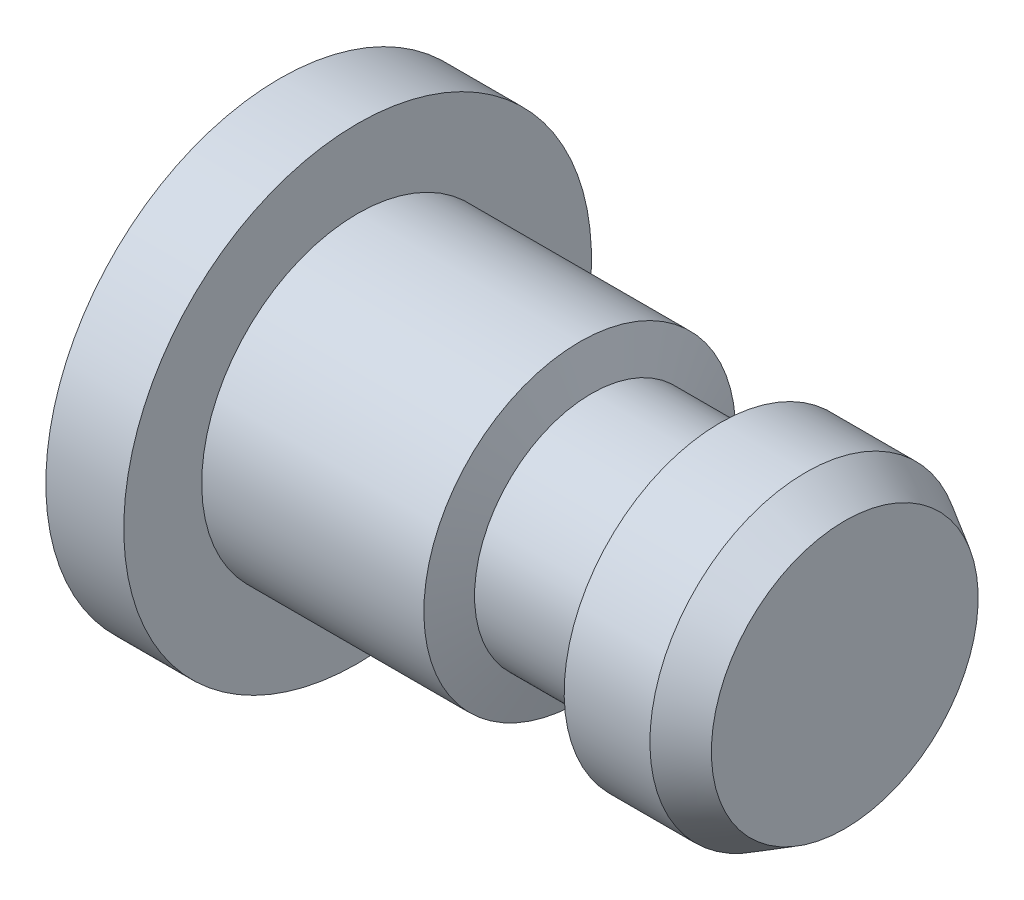
ISO-10303-21;
HEADER;
FILE_DESCRIPTION(('STEP AP214'),'2;1');
FILE_NAME('part.step','',(''),(''),'','','');
FILE_SCHEMA(('AUTOMOTIVE_DESIGN { 1 0 10303 214 1 1 1 1 }'));
ENDSEC;
DATA;
#1=APPLICATION_CONTEXT('core data for automotive mechanical design processes');
#2=APPLICATION_PROTOCOL_DEFINITION('international standard','automotive_design',2000,#1);
#3=PRODUCT_CONTEXT('',#1,'mechanical');
#4=PRODUCT('Part','Part','',(#3));
#5=PRODUCT_RELATED_PRODUCT_CATEGORY('part','',(#4));
#6=PRODUCT_DEFINITION_FORMATION('','',#4);
#7=PRODUCT_DEFINITION_CONTEXT('part definition',#1,'design');
#8=PRODUCT_DEFINITION('design','',#6,#7);
#9=PRODUCT_DEFINITION_SHAPE('','',#8);
#10=(LENGTH_UNIT() NAMED_UNIT(*) SI_UNIT(.MILLI.,.METRE.));
#11=(NAMED_UNIT(*) PLANE_ANGLE_UNIT() SI_UNIT($,.RADIAN.));
#12=(NAMED_UNIT(*) SI_UNIT($,.STERADIAN.) SOLID_ANGLE_UNIT());
#13=UNCERTAINTY_MEASURE_WITH_UNIT(LENGTH_MEASURE(1.E-05),#10,'distance_accuracy_value','');
#14=(GEOMETRIC_REPRESENTATION_CONTEXT(3) GLOBAL_UNCERTAINTY_ASSIGNED_CONTEXT((#13)) GLOBAL_UNIT_ASSIGNED_CONTEXT((#10,
#11,#12)) REPRESENTATION_CONTEXT('',''));
#15=CARTESIAN_POINT('',(0.,0.,0.));
#16=DIRECTION('',(0.,0.,1.));
#17=DIRECTION('',(1.,0.,0.));
#18=AXIS2_PLACEMENT_3D('',#15,#16,#17);
#19=CARTESIAN_POINT('',(0.,0.,0.));
#20=DIRECTION('',(-1.,0.,0.));
#21=DIRECTION('',(0.,-1.,0.));
#22=AXIS2_PLACEMENT_3D('',#19,#20,#21);
#23=PLANE('',#22);
#24=CARTESIAN_POINT('',(0.,0.,0.));
#25=DIRECTION('',(1.,0.,0.));
#26=DIRECTION('',(0.,1.,0.));
#27=AXIS2_PLACEMENT_3D('',#24,#25,#26);
#28=CIRCLE('',#27,6.);
#29=CARTESIAN_POINT('',(0.,6.,0.));
#30=VERTEX_POINT('',#29);
#31=EDGE_CURVE('E62',#30,#30,#28,.T.);
#32=ORIENTED_EDGE('',*,*,#31,.F.);
#33=EDGE_LOOP('',(#32));
#34=FACE_BOUND('',#33,.T.);
#35=ADVANCED_FACE('F46',(#34),#23,.T.);
#36=CARTESIAN_POINT('',(14.5,0.,0.));
#37=DIRECTION('',(1.,0.,0.));
#38=DIRECTION('',(0.,1.,0.));
#39=AXIS2_PLACEMENT_3D('',#36,#37,#38);
#40=CYLINDRICAL_SURFACE('',#39,6.);
#41=ORIENTED_EDGE('',*,*,#31,.T.);
#42=EDGE_LOOP('',(#41));
#43=FACE_BOUND('',#42,.T.);
#44=CARTESIAN_POINT('',(2.,0.,0.));
#45=DIRECTION('',(1.,0.,0.));
#46=DIRECTION('',(0.,1.,0.));
#47=AXIS2_PLACEMENT_3D('',#44,#45,#46);
#48=CIRCLE('',#47,6.);
#49=CARTESIAN_POINT('',(2.,6.,0.));
#50=VERTEX_POINT('',#49);
#51=EDGE_CURVE('E69',#50,#50,#48,.T.);
#52=ORIENTED_EDGE('',*,*,#51,.F.);
#53=EDGE_LOOP('',(#52));
#54=FACE_BOUND('',#53,.T.);
#55=ADVANCED_FACE('F115',(#43,#54),#40,.T.);
#56=CARTESIAN_POINT('',(2.,6.,0.));
#57=DIRECTION('',(1.,0.,0.));
#58=DIRECTION('',(0.,1.,0.));
#59=AXIS2_PLACEMENT_3D('',#56,#57,#58);
#60=PLANE('',#59);
#61=ORIENTED_EDGE('',*,*,#51,.T.);
#62=EDGE_LOOP('',(#61));
#63=FACE_BOUND('',#62,.T.);
#64=CARTESIAN_POINT('',(2.,0.,0.));
#65=DIRECTION('',(1.,0.,0.));
#66=DIRECTION('',(0.,1.,0.));
#67=AXIS2_PLACEMENT_3D('',#64,#65,#66);
#68=CIRCLE('',#67,4.);
#69=CARTESIAN_POINT('',(2.,4.,0.));
#70=VERTEX_POINT('',#69);
#71=EDGE_CURVE('E75',#70,#70,#68,.T.);
#72=ORIENTED_EDGE('',*,*,#71,.F.);
#73=EDGE_LOOP('',(#72));
#74=FACE_BOUND('',#73,.T.);
#75=ADVANCED_FACE('F120',(#63,#74),#60,.T.);
#76=CARTESIAN_POINT('',(14.5,0.,0.));
#77=DIRECTION('',(1.,0.,0.));
#78=DIRECTION('',(0.,1.,0.));
#79=AXIS2_PLACEMENT_3D('',#76,#77,#78);
#80=CYLINDRICAL_SURFACE('',#79,4.);
#81=ORIENTED_EDGE('',*,*,#71,.T.);
#82=EDGE_LOOP('',(#81));
#83=FACE_BOUND('',#82,.T.);
#84=CARTESIAN_POINT('',(7.7,0.,0.));
#85=DIRECTION('',(1.,0.,0.));
#86=DIRECTION('',(0.,1.,0.));
#87=AXIS2_PLACEMENT_3D('',#84,#85,#86);
#88=CIRCLE('',#87,4.);
#89=CARTESIAN_POINT('',(7.7,3.99999999999999,0.));
#90=VERTEX_POINT('',#89);
#91=EDGE_CURVE('E79',#90,#90,#88,.T.);
#92=ORIENTED_EDGE('',*,*,#91,.F.);
#93=EDGE_LOOP('',(#92));
#94=FACE_BOUND('',#93,.T.);
#95=ADVANCED_FACE('F127',(#83,#94),#80,.T.);
#96=CARTESIAN_POINT('',(8.,0.,0.));
#97=DIRECTION('',(-1.,0.,0.));
#98=DIRECTION('',(0.,-1.,0.));
#99=AXIS2_PLACEMENT_3D('',#96,#97,#98);
#100=CONICAL_SURFACE('',#99,2.99999999999999,1.27933953231703);
#101=ORIENTED_EDGE('',*,*,#91,.T.);
#102=EDGE_LOOP('',(#101));
#103=FACE_BOUND('',#102,.T.);
#104=CARTESIAN_POINT('',(8.,0.,0.));
#105=DIRECTION('',(1.,0.,0.));
#106=DIRECTION('',(0.,1.,0.));
#107=AXIS2_PLACEMENT_3D('',#104,#105,#106);
#108=CIRCLE('',#107,2.99999999999999);
#109=CARTESIAN_POINT('',(8.,2.99999999999999,0.));
#110=VERTEX_POINT('',#109);
#111=EDGE_CURVE('E83',#110,#110,#108,.T.);
#112=ORIENTED_EDGE('',*,*,#111,.F.);
#113=EDGE_LOOP('',(#112));
#114=FACE_BOUND('',#113,.T.);
#115=ADVANCED_FACE('F111',(#103,#114),#100,.T.);
#116=CARTESIAN_POINT('',(14.5,0.,0.));
#117=DIRECTION('',(1.,0.,0.));
#118=DIRECTION('',(0.,1.,0.));
#119=AXIS2_PLACEMENT_3D('',#116,#117,#118);
#120=CYLINDRICAL_SURFACE('',#119,2.99999999999999);
#121=ORIENTED_EDGE('',*,*,#111,.T.);
#122=EDGE_LOOP('',(#121));
#123=FACE_BOUND('',#122,.T.);
#124=CARTESIAN_POINT('',(11.,0.,0.));
#125=DIRECTION('',(1.,0.,0.));
#126=DIRECTION('',(0.,1.,0.));
#127=AXIS2_PLACEMENT_3D('',#124,#125,#126);
#128=CIRCLE('',#127,2.99999999999999);
#129=CARTESIAN_POINT('',(11.,2.99999999999999,0.));
#130=VERTEX_POINT('',#129);
#131=EDGE_CURVE('E87',#130,#130,#128,.T.);
#132=ORIENTED_EDGE('',*,*,#131,.F.);
#133=EDGE_LOOP('',(#132));
#134=FACE_BOUND('',#133,.T.);
#135=ADVANCED_FACE('F102',(#123,#134),#120,.T.);
#136=CARTESIAN_POINT('',(11.3,0.,0.));
#137=DIRECTION('',(1.,0.,0.));
#138=DIRECTION('',(0.,1.,0.));
#139=AXIS2_PLACEMENT_3D('',#136,#137,#138);
#140=CONICAL_SURFACE('',#139,4.,1.27933953231703);
#141=ORIENTED_EDGE('',*,*,#131,.T.);
#142=EDGE_LOOP('',(#141));
#143=FACE_BOUND('',#142,.T.);
#144=CARTESIAN_POINT('',(11.3,0.,0.));
#145=DIRECTION('',(1.,0.,0.));
#146=DIRECTION('',(0.,1.,0.));
#147=AXIS2_PLACEMENT_3D('',#144,#145,#146);
#148=CIRCLE('',#147,4.);
#149=CARTESIAN_POINT('',(11.3,4.,0.));
#150=VERTEX_POINT('',#149);
#151=EDGE_CURVE('E91',#150,#150,#148,.T.);
#152=ORIENTED_EDGE('',*,*,#151,.F.);
#153=EDGE_LOOP('',(#152));
#154=FACE_BOUND('',#153,.T.);
#155=ADVANCED_FACE('F100',(#143,#154),#140,.T.);
#156=CARTESIAN_POINT('',(14.5,0.,0.));
#157=DIRECTION('',(1.,0.,0.));
#158=DIRECTION('',(0.,1.,0.));
#159=AXIS2_PLACEMENT_3D('',#156,#157,#158);
#160=CYLINDRICAL_SURFACE('',#159,4.);
#161=CARTESIAN_POINT('',(13.5,0.,0.));
#162=DIRECTION('',(1.,0.,0.));
#163=DIRECTION('',(0.,1.,0.));
#164=AXIS2_PLACEMENT_3D('',#161,#162,#163);
#165=CIRCLE('',#164,4.);
#166=CARTESIAN_POINT('',(13.5,4.,0.));
#167=VERTEX_POINT('',#166);
#168=EDGE_CURVE('E10',#167,#167,#165,.F.);
#169=ORIENTED_EDGE('',*,*,#168,.T.);
#170=EDGE_LOOP('',(#169));
#171=FACE_BOUND('',#170,.T.);
#172=ORIENTED_EDGE('',*,*,#151,.T.);
#173=EDGE_LOOP('',(#172));
#174=FACE_BOUND('',#173,.T.);
#175=ADVANCED_FACE('F98',(#171,#174),#160,.T.);
#176=CARTESIAN_POINT('',(14.5,4.,0.));
#177=DIRECTION('',(1.,0.,0.));
#178=DIRECTION('',(0.,1.,0.));
#179=AXIS2_PLACEMENT_3D('',#176,#177,#178);
#180=PLANE('',#179);
#181=CARTESIAN_POINT('',(14.5,0.,0.));
#182=DIRECTION('',(1.,0.,0.));
#183=DIRECTION('',(0.,1.,0.));
#184=AXIS2_PLACEMENT_3D('',#181,#182,#183);
#185=CIRCLE('',#184,3.42264973081037);
#186=CARTESIAN_POINT('',(14.5,3.42264973081037,0.));
#187=VERTEX_POINT('',#186);
#188=EDGE_CURVE('E55',#187,#187,#185,.T.);
#189=ORIENTED_EDGE('',*,*,#188,.T.);
#190=EDGE_LOOP('',(#189));
#191=FACE_BOUND('',#190,.T.);
#192=ADVANCED_FACE('F109',(#191),#180,.T.);
#193=CARTESIAN_POINT('',(14.5,0.,0.));
#194=DIRECTION('',(-1.,0.,0.));
#195=DIRECTION('',(0.,-1.,0.));
#196=AXIS2_PLACEMENT_3D('',#193,#194,#195);
#197=CONICAL_SURFACE('',#196,3.42264973081037,0.523598775598298);
#198=ORIENTED_EDGE('',*,*,#168,.F.);
#199=EDGE_LOOP('',(#198));
#200=FACE_BOUND('',#199,.T.);
#201=ORIENTED_EDGE('',*,*,#188,.F.);
#202=EDGE_LOOP('',(#201));
#203=FACE_BOUND('',#202,.T.);
#204=ADVANCED_FACE('F49',(#200,#203),#197,.T.);
#205=CLOSED_SHELL('',(#35,#55,#75,#95,#115,#135,#155,#175,#192,#204));
#206=MANIFOLD_SOLID_BREP('B2',#205);
#207=ADVANCED_BREP_SHAPE_REPRESENTATION('',(#18,#206),#14);
#208=SHAPE_DEFINITION_REPRESENTATION(#9,#207);
ENDSEC;
END-ISO-10303-21;
